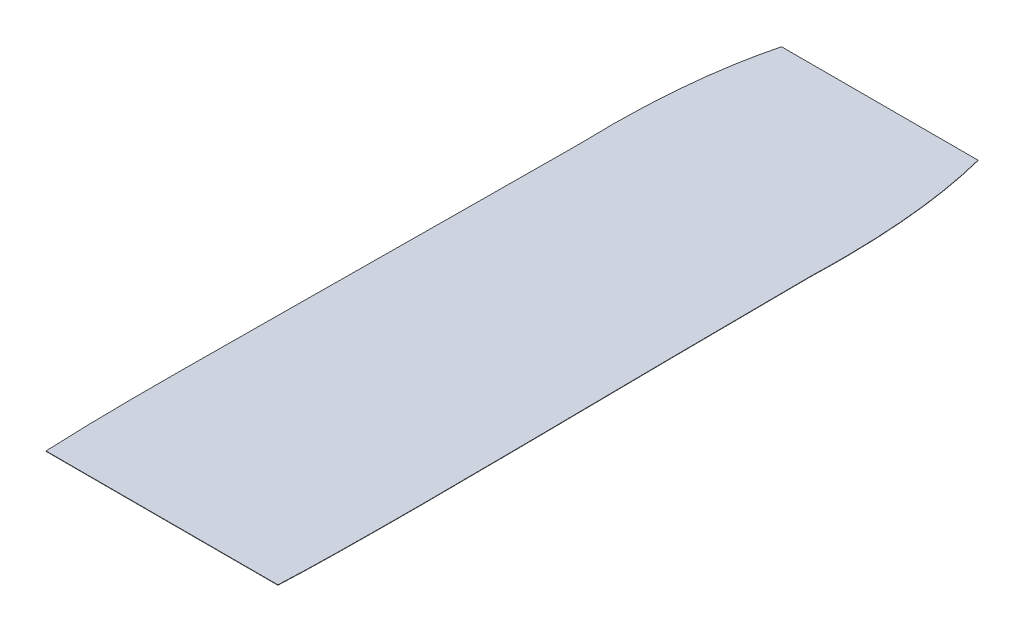
ISO-10303-21;
HEADER;
FILE_DESCRIPTION(('STEP AP214'),'2;1');
FILE_NAME('part.step','',(''),(''),'','','');
FILE_SCHEMA(('AUTOMOTIVE_DESIGN { 1 0 10303 214 1 1 1 1 }'));
ENDSEC;
DATA;
#1=APPLICATION_CONTEXT('core data for automotive mechanical design processes');
#2=APPLICATION_PROTOCOL_DEFINITION('international standard','automotive_design',2000,#1);
#3=PRODUCT_CONTEXT('',#1,'mechanical');
#4=PRODUCT('Part','Part','',(#3));
#5=PRODUCT_RELATED_PRODUCT_CATEGORY('part','',(#4));
#6=PRODUCT_DEFINITION_FORMATION('','',#4);
#7=PRODUCT_DEFINITION_CONTEXT('part definition',#1,'design');
#8=PRODUCT_DEFINITION('design','',#6,#7);
#9=PRODUCT_DEFINITION_SHAPE('','',#8);
#10=(LENGTH_UNIT() NAMED_UNIT(*) SI_UNIT(.MILLI.,.METRE.));
#11=(NAMED_UNIT(*) PLANE_ANGLE_UNIT() SI_UNIT($,.RADIAN.));
#12=(NAMED_UNIT(*) SI_UNIT($,.STERADIAN.) SOLID_ANGLE_UNIT());
#13=UNCERTAINTY_MEASURE_WITH_UNIT(LENGTH_MEASURE(1.E-05),#10,'distance_accuracy_value','');
#14=(GEOMETRIC_REPRESENTATION_CONTEXT(3) GLOBAL_UNCERTAINTY_ASSIGNED_CONTEXT((#13)) GLOBAL_UNIT_ASSIGNED_CONTEXT((#10,
#11,#12)) REPRESENTATION_CONTEXT('',''));
#15=CARTESIAN_POINT('',(0.,0.,0.));
#16=DIRECTION('',(0.,0.,1.));
#17=DIRECTION('',(1.,0.,0.));
#18=AXIS2_PLACEMENT_3D('',#15,#16,#17);
#19=CARTESIAN_POINT('',(-72.0046808004524,317.354714724633,-1400.77343560549));
#20=DIRECTION('',(0.,0.,1.));
#21=DIRECTION('',(1.,0.,0.));
#22=AXIS2_PLACEMENT_3D('',#19,#20,#21);
#23=PLANE('',#22);
#24=DIRECTION('',(-1.,0.,0.));
#25=VECTOR('',#24,1.);
#26=CARTESIAN_POINT('',(-72.0046808004524,130.274354409438,-1400.77343560549));
#27=LINE('',#26,#25);
#28=CARTESIAN_POINT('',(392.357809865248,130.274354409438,-1400.77343560549));
#29=VERTEX_POINT('',#28);
#30=CARTESIAN_POINT('',(-142.121848227152,130.274354409438,-1400.77343557769));
#31=VERTEX_POINT('',#30);
#32=EDGE_CURVE('E195',#29,#31,#27,.T.);
#33=ORIENTED_EDGE('',*,*,#32,.F.);
#34=DIRECTION('',(0.,1.,0.));
#35=VECTOR('',#34,1.);
#36=CARTESIAN_POINT('',(392.357809865248,128.784425539332,-1400.77343557769));
#37=LINE('',#36,#35);
#38=CARTESIAN_POINT('',(392.357809865248,129.274354409438,-1400.77343560549));
#39=VERTEX_POINT('',#38);
#40=EDGE_CURVE('E156',#39,#29,#37,.T.);
#41=ORIENTED_EDGE('',*,*,#40,.F.);
#42=DIRECTION('',(1.,0.,0.));
#43=VECTOR('',#42,1.);
#44=CARTESIAN_POINT('',(-72.0046808004524,129.274354409438,-1400.77343560549));
#45=LINE('',#44,#43);
#46=CARTESIAN_POINT('',(-142.121848227152,129.274354409438,-1400.77343557769));
#47=VERTEX_POINT('',#46);
#48=EDGE_CURVE('E355',#47,#39,#45,.T.);
#49=ORIENTED_EDGE('',*,*,#48,.F.);
#50=DIRECTION('',(0.,1.,0.));
#51=VECTOR('',#50,1.);
#52=CARTESIAN_POINT('',(-142.121848227152,128.784425539332,-1400.77343557769));
#53=LINE('',#52,#51);
#54=EDGE_CURVE('E36',#47,#31,#53,.T.);
#55=ORIENTED_EDGE('',*,*,#54,.T.);
#56=EDGE_LOOP('',(#33,#41,#49,#55));
#57=FACE_BOUND('',#56,.T.);
#58=ADVANCED_FACE('F33',(#57),#23,.F.);
#59=CARTESIAN_POINT('',(-190.555829317511,178.784425539332,-514.004715235418));
#60=DIRECTION('',(-0.999970152938198,0.,-0.0077261395766045));
#61=DIRECTION('',(-0.0077261395766045,0.,0.999970152938198));
#62=AXIS2_PLACEMENT_3D('',#59,#60,#61);
#63=PLANE('',#62);
#64=DIRECTION('',(0.,-1.,0.));
#65=VECTOR('',#64,1.);
#66=CARTESIAN_POINT('',(-190.571261738774,178.784425539332,-512.007345074322));
#67=LINE('',#66,#65);
#68=CARTESIAN_POINT('',(-190.571261738774,130.274354409438,-512.007345074322));
#69=VERTEX_POINT('',#68);
#70=CARTESIAN_POINT('',(-190.571261738774,129.274354409438,-512.007345074322));
#71=VERTEX_POINT('',#70);
#72=EDGE_CURVE('E215',#69,#71,#67,.T.);
#73=ORIENTED_EDGE('',*,*,#72,.F.);
#74=DIRECTION('',(0.0077261395766045,0.,-0.999970152938198));
#75=VECTOR('',#74,1.);
#76=CARTESIAN_POINT('',(-190.555829317511,130.274354409438,-514.004715235418));
#77=LINE('',#76,#75);
#78=CARTESIAN_POINT('',(-190.555829317511,130.274354409438,-514.004715235418));
#79=VERTEX_POINT('',#78);
#80=EDGE_CURVE('E56',#69,#79,#77,.T.);
#81=ORIENTED_EDGE('',*,*,#80,.T.);
#82=DIRECTION('',(0.,-1.,0.));
#83=VECTOR('',#82,1.);
#84=CARTESIAN_POINT('',(-190.555829317511,178.784425539332,-514.004715235418));
#85=LINE('',#84,#83);
#86=CARTESIAN_POINT('',(-190.555829317511,129.274354409438,-514.004715235418));
#87=VERTEX_POINT('',#86);
#88=EDGE_CURVE('E212',#79,#87,#85,.T.);
#89=ORIENTED_EDGE('',*,*,#88,.T.);
#90=DIRECTION('',(-0.0077261395766045,0.,0.999970152938198));
#91=VECTOR('',#90,1.);
#92=CARTESIAN_POINT('',(-190.555829317511,129.274354409438,-514.004715235418));
#93=LINE('',#92,#91);
#94=EDGE_CURVE('E129',#87,#71,#93,.T.);
#95=ORIENTED_EDGE('',*,*,#94,.T.);
#96=EDGE_LOOP('',(#73,#81,#89,#95));
#97=FACE_BOUND('',#96,.T.);
#98=ADVANCED_FACE('F177',(#97),#63,.T.);
#99=CARTESIAN_POINT('',(-155.592526066502,178.784425539332,552.03909036691));
#100=DIRECTION('',(0.,0.,1.));
#101=DIRECTION('',(1.,0.,0.));
#102=AXIS2_PLACEMENT_3D('',#99,#100,#101);
#103=PLANE('',#102);
#104=DIRECTION('',(0.,1.,0.));
#105=VECTOR('',#104,1.);
#106=CARTESIAN_POINT('',(440.559294575648,128.784425539332,552.039090366909));
#107=LINE('',#106,#105);
#108=CARTESIAN_POINT('',(440.559294575648,129.274354409438,552.03909036691));
#109=VERTEX_POINT('',#108);
#110=CARTESIAN_POINT('',(440.559294575648,130.274354409438,552.03909036691));
#111=VERTEX_POINT('',#110);
#112=EDGE_CURVE('E136',#109,#111,#107,.T.);
#113=ORIENTED_EDGE('',*,*,#112,.T.);
#114=DIRECTION('',(-1.,0.,0.));
#115=VECTOR('',#114,1.);
#116=CARTESIAN_POINT('',(-200.011016594819,130.274354409438,552.03909036691));
#117=LINE('',#116,#115);
#118=CARTESIAN_POINT('',(-190.323332937552,130.274354409438,552.03909036691));
#119=VERTEX_POINT('',#118);
#120=EDGE_CURVE('E120',#111,#119,#117,.T.);
#121=ORIENTED_EDGE('',*,*,#120,.T.);
#122=DIRECTION('',(0.,1.,0.));
#123=VECTOR('',#122,1.);
#124=CARTESIAN_POINT('',(-190.323332937552,128.784425539332,552.03909036691));
#125=LINE('',#124,#123);
#126=CARTESIAN_POINT('',(-190.323332937552,129.274354409438,552.03909036691));
#127=VERTEX_POINT('',#126);
#128=EDGE_CURVE('E139',#127,#119,#125,.T.);
#129=ORIENTED_EDGE('',*,*,#128,.F.);
#130=DIRECTION('',(1.,0.,0.));
#131=VECTOR('',#130,1.);
#132=CARTESIAN_POINT('',(-200.011016594819,129.274354409438,552.03909036691));
#133=LINE('',#132,#131);
#134=EDGE_CURVE('E49',#127,#109,#133,.T.);
#135=ORIENTED_EDGE('',*,*,#134,.T.);
#136=EDGE_LOOP('',(#113,#121,#129,#135));
#137=FACE_BOUND('',#136,.T.);
#138=ADVANCED_FACE('F142',(#137),#103,.T.);
#139=CARTESIAN_POINT('',(440.820829905303,178.784425539332,-510.258926198423));
#140=DIRECTION('',(0.999969906629394,0.,-0.00775795305478673));
#141=DIRECTION('',(-0.00775795305478673,0.,-0.999969906629394));
#142=AXIS2_PLACEMENT_3D('',#139,#140,#141);
#143=PLANE('',#142);
#144=DIRECTION('',(0.,-1.,0.));
#145=VECTOR('',#144,1.);
#146=CARTESIAN_POINT('',(440.796492080159,178.784425539332,-513.395976985423));
#147=LINE('',#146,#145);
#148=CARTESIAN_POINT('',(440.796492080159,130.274354409438,-513.395976985423));
#149=VERTEX_POINT('',#148);
#150=CARTESIAN_POINT('',(440.796492080159,129.274354409438,-513.395976985423));
#151=VERTEX_POINT('',#150);
#152=EDGE_CURVE('E209',#149,#151,#147,.T.);
#153=ORIENTED_EDGE('',*,*,#152,.F.);
#154=DIRECTION('',(0.00775795305478673,0.,0.999969906629394));
#155=VECTOR('',#154,1.);
#156=CARTESIAN_POINT('',(440.820829905303,130.274354409438,-510.258926198423));
#157=LINE('',#156,#155);
#158=CARTESIAN_POINT('',(440.820829905303,130.274354409438,-510.258926198423));
#159=VERTEX_POINT('',#158);
#160=EDGE_CURVE('E293',#149,#159,#157,.T.);
#161=ORIENTED_EDGE('',*,*,#160,.T.);
#162=DIRECTION('',(0.,-1.,0.));
#163=VECTOR('',#162,1.);
#164=CARTESIAN_POINT('',(440.820829905303,178.784425539332,-510.258926198423));
#165=LINE('',#164,#163);
#166=CARTESIAN_POINT('',(440.820829905303,129.274354409438,-510.258926198423));
#167=VERTEX_POINT('',#166);
#168=EDGE_CURVE('E218',#159,#167,#165,.T.);
#169=ORIENTED_EDGE('',*,*,#168,.T.);
#170=DIRECTION('',(-0.00775795305478673,0.,-0.999969906629394));
#171=VECTOR('',#170,1.);
#172=CARTESIAN_POINT('',(440.820829905303,129.274354409438,-510.258926198423));
#173=LINE('',#172,#171);
#174=EDGE_CURVE('E301',#167,#151,#173,.T.);
#175=ORIENTED_EDGE('',*,*,#174,.T.);
#176=EDGE_LOOP('',(#153,#161,#169,#175));
#177=FACE_BOUND('',#176,.T.);
#178=ADVANCED_FACE('F174',(#177),#143,.T.);
#179=CARTESIAN_POINT('',(392.357809865248,128.784425539332,-1400.77343557769));
#180=CARTESIAN_POINT('',(424.997052669176,128.784425539332,-1273.77599509534));
#181=CARTESIAN_POINT('',(444.759126928356,128.784425539332,-1111.03634228195));
#182=CARTESIAN_POINT('',(438.121071457448,128.784425539332,-898.390838476681));
#183=B_SPLINE_CURVE_WITH_KNOTS('',3,(#179,#180,#181,#182),.UNSPECIFIED.,.F.,.F.,(4,4),
(0.571508355999423,1.),.UNSPECIFIED.);
#184=DIRECTION('',(0.,1.,0.));
#185=VECTOR('',#184,1.);
#186=SURFACE_OF_LINEAR_EXTRUSION('',#183,#185);
#187=CARTESIAN_POINT('',(392.357809865248,130.274354409438,-1400.77343557769));
#188=CARTESIAN_POINT('',(424.997052669176,130.274354409438,-1273.77599509534));
#189=CARTESIAN_POINT('',(444.759126928356,130.274354409438,-1111.03634228195));
#190=CARTESIAN_POINT('',(438.121071457448,130.274354409438,-898.390838476681));
#191=B_SPLINE_CURVE_WITH_KNOTS('',3,(#187,#188,#189,#190),.UNSPECIFIED.,.F.,.F.,(4,4),
(0.571508355999423,1.),.UNSPECIFIED.);
#192=CARTESIAN_POINT('',(438.121071457448,130.274354409438,-898.390838476681));
#193=VERTEX_POINT('',#192);
#194=EDGE_CURVE('E200',#193,#29,#191,.F.);
#195=ORIENTED_EDGE('',*,*,#194,.F.);
#196=DIRECTION('',(0.,1.,0.));
#197=VECTOR('',#196,1.);
#198=CARTESIAN_POINT('',(438.121071457448,128.784425539332,-898.390838476681));
#199=LINE('',#198,#197);
#200=CARTESIAN_POINT('',(438.121071457448,129.274354409438,-898.390838476681));
#201=VERTEX_POINT('',#200);
#202=EDGE_CURVE('E208',#201,#193,#199,.T.);
#203=ORIENTED_EDGE('',*,*,#202,.F.);
#204=CARTESIAN_POINT('',(392.357809865248,129.274354409438,-1400.77343557769));
#205=CARTESIAN_POINT('',(424.997052669176,129.274354409438,-1273.77599509534));
#206=CARTESIAN_POINT('',(444.759126928356,129.274354409438,-1111.03634228195));
#207=CARTESIAN_POINT('',(438.121071457448,129.274354409438,-898.390838476681));
#208=B_SPLINE_CURVE_WITH_KNOTS('',3,(#204,#205,#206,#207),.UNSPECIFIED.,.F.,.F.,(4,4),
(0.571508355999423,1.),.UNSPECIFIED.);
#209=EDGE_CURVE('E207',#39,#201,#208,.T.);
#210=ORIENTED_EDGE('',*,*,#209,.F.);
#211=ORIENTED_EDGE('',*,*,#40,.T.);
#212=EDGE_LOOP('',(#195,#203,#210,#211));
#213=FACE_BOUND('',#212,.T.);
#214=ADVANCED_FACE('F169',(#213),#186,.F.);
#215=CARTESIAN_POINT('',(438.121071457448,128.784425539332,-898.390838476681));
#216=CARTESIAN_POINT('',(438.907855871214,128.784425539332,-769.879715580884));
#217=CARTESIAN_POINT('',(439.807782699388,128.784425539332,-641.369444082674));
#218=CARTESIAN_POINT('',(440.800633430048,128.784425539332,-512.85987183759));
#219=B_SPLINE_CURVE_WITH_KNOTS('',3,(#215,#216,#217,#218),.UNSPECIFIED.,.F.,.F.,(4,4),(0.,1.),.UNSPECIFIED.);
#220=DIRECTION('',(0.,1.,0.));
#221=VECTOR('',#220,1.);
#222=SURFACE_OF_LINEAR_EXTRUSION('',#219,#221);
#223=CARTESIAN_POINT('',(438.121071457448,130.274354409438,-898.390838476681));
#224=CARTESIAN_POINT('',(438.907855871214,130.274354409438,-769.879715580884));
#225=CARTESIAN_POINT('',(439.807782699388,130.274354409438,-641.369444082674));
#226=CARTESIAN_POINT('',(440.800633430048,130.274354409438,-512.85987183759));
#227=B_SPLINE_CURVE_WITH_KNOTS('',3,(#223,#224,#225,#226),.UNSPECIFIED.,.F.,.F.,(4,4),(0.,1.),.UNSPECIFIED.);
#228=EDGE_CURVE('E329',#149,#193,#227,.F.);
#229=ORIENTED_EDGE('',*,*,#228,.F.);
#230=ORIENTED_EDGE('',*,*,#152,.T.);
#231=CARTESIAN_POINT('',(438.121071457448,129.274354409438,-898.390838476681));
#232=CARTESIAN_POINT('',(438.907855871214,129.274354409438,-769.879715580884));
#233=CARTESIAN_POINT('',(439.807782699388,129.274354409438,-641.369444082674));
#234=CARTESIAN_POINT('',(440.800633430048,129.274354409438,-512.85987183759));
#235=B_SPLINE_CURVE_WITH_KNOTS('',3,(#231,#232,#233,#234),.UNSPECIFIED.,.F.,.F.,(4,4),(0.,1.),.UNSPECIFIED.);
#236=EDGE_CURVE('E353',#201,#151,#235,.T.);
#237=ORIENTED_EDGE('',*,*,#236,.F.);
#238=ORIENTED_EDGE('',*,*,#202,.T.);
#239=EDGE_LOOP('',(#229,#230,#237,#238));
#240=FACE_BOUND('',#239,.T.);
#241=ADVANCED_FACE('F173',(#240),#222,.F.);
#242=CARTESIAN_POINT('',(440.800633430048,128.784425539332,-512.859871837591));
#243=CARTESIAN_POINT('',(443.15122206887,128.784425539332,-208.667210221883));
#244=CARTESIAN_POINT('',(449.545543980227,128.784425539332,95.6004178072583));
#245=CARTESIAN_POINT('',(445.006281296166,128.784425539332,399.703094961221));
#246=B_SPLINE_CURVE_WITH_KNOTS('',3,(#242,#243,#244,#245),.UNSPECIFIED.,.F.,.F.,(4,4),(0.,1.),.UNSPECIFIED.);
#247=DIRECTION('',(0.,1.,0.));
#248=VECTOR('',#247,1.);
#249=SURFACE_OF_LINEAR_EXTRUSION('',#246,#248);
#250=CARTESIAN_POINT('',(440.800633430048,130.274354409438,-512.859871837591));
#251=CARTESIAN_POINT('',(443.15122206887,130.274354409438,-208.667210221883));
#252=CARTESIAN_POINT('',(449.545543980227,130.274354409438,95.6004178072583));
#253=CARTESIAN_POINT('',(445.006281296166,130.274354409438,399.703094961221));
#254=B_SPLINE_CURVE_WITH_KNOTS('',3,(#250,#251,#252,#253),.UNSPECIFIED.,.F.,.F.,(4,4),(0.,1.),.UNSPECIFIED.);
#255=CARTESIAN_POINT('',(445.006281296166,130.274354409438,399.703094961221));
#256=VERTEX_POINT('',#255);
#257=EDGE_CURVE('E290',#256,#159,#254,.F.);
#258=ORIENTED_EDGE('',*,*,#257,.F.);
#259=DIRECTION('',(0.,1.,0.));
#260=VECTOR('',#259,1.);
#261=CARTESIAN_POINT('',(445.006281296166,128.784425539332,399.703094961221));
#262=LINE('',#261,#260);
#263=CARTESIAN_POINT('',(445.006281296166,129.274354409438,399.703094961221));
#264=VERTEX_POINT('',#263);
#265=EDGE_CURVE('E144',#264,#256,#262,.T.);
#266=ORIENTED_EDGE('',*,*,#265,.F.);
#267=CARTESIAN_POINT('',(440.800633430048,129.274354409438,-512.859871837591));
#268=CARTESIAN_POINT('',(443.15122206887,129.274354409438,-208.667210221883));
#269=CARTESIAN_POINT('',(449.545543980227,129.274354409438,95.6004178072583));
#270=CARTESIAN_POINT('',(445.006281296166,129.274354409438,399.703094961221));
#271=B_SPLINE_CURVE_WITH_KNOTS('',3,(#267,#268,#269,#270),.UNSPECIFIED.,.F.,.F.,(4,4),(0.,1.),.UNSPECIFIED.);
#272=EDGE_CURVE('E298',#167,#264,#271,.T.);
#273=ORIENTED_EDGE('',*,*,#272,.F.);
#274=ORIENTED_EDGE('',*,*,#168,.F.);
#275=EDGE_LOOP('',(#258,#266,#273,#274));
#276=FACE_BOUND('',#275,.T.);
#277=ADVANCED_FACE('F273',(#276),#249,.F.);
#278=CARTESIAN_POINT('',(445.006281296166,128.784425539332,399.703094961221));
#279=DIRECTION('',(-0.999888607152886,0.,-0.0149255916419641));
#280=DIRECTION('',(0.0149255916419641,0.,-0.999888607152886));
#281=AXIS2_PLACEMENT_3D('',#278,#279,#280);
#282=PLANE('',#281);
#283=DIRECTION('',(0.0149255916419641,0.,-0.999888607152886));
#284=VECTOR('',#283,1.);
#285=CARTESIAN_POINT('',(445.006281296166,130.274354409438,399.703094961221));
#286=LINE('',#285,#284);
#287=CARTESIAN_POINT('',(445.006175558562,130.274354409438,399.710178487833));
#288=VERTEX_POINT('',#287);
#289=EDGE_CURVE('E140',#288,#256,#286,.T.);
#290=ORIENTED_EDGE('',*,*,#289,.F.);
#291=DIRECTION('',(0.,1.,0.));
#292=VECTOR('',#291,1.);
#293=CARTESIAN_POINT('',(445.006175558562,128.784425539332,399.710178487833));
#294=LINE('',#293,#292);
#295=CARTESIAN_POINT('',(445.006175558562,129.274354409438,399.710178487833));
#296=VERTEX_POINT('',#295);
#297=EDGE_CURVE('E138',#296,#288,#294,.T.);
#298=ORIENTED_EDGE('',*,*,#297,.F.);
#299=DIRECTION('',(-0.0149255916419641,0.,0.999888607152886));
#300=VECTOR('',#299,1.);
#301=CARTESIAN_POINT('',(445.006281296166,129.274354409438,399.703094961221));
#302=LINE('',#301,#300);
#303=EDGE_CURVE('E296',#264,#296,#302,.T.);
#304=ORIENTED_EDGE('',*,*,#303,.F.);
#305=ORIENTED_EDGE('',*,*,#265,.T.);
#306=EDGE_LOOP('',(#290,#298,#304,#305));
#307=FACE_BOUND('',#306,.T.);
#308=ADVANCED_FACE('F271',(#307),#282,.F.);
#309=CARTESIAN_POINT('',(445.006175558562,128.784425539332,399.710178487833));
#310=CARTESIAN_POINT('',(444.247971427042,128.784425539332,450.501714720233));
#311=CARTESIAN_POINT('',(442.930714642795,128.784425539332,501.281490469828));
#312=CARTESIAN_POINT('',(440.559294575648,128.784425539332,552.039090366909));
#313=B_SPLINE_CURVE_WITH_KNOTS('',3,(#309,#310,#311,#312),.UNSPECIFIED.,.F.,.F.,(4,4),(0.,1.),.UNSPECIFIED.);
#314=DIRECTION('',(0.,1.,0.));
#315=VECTOR('',#314,1.);
#316=SURFACE_OF_LINEAR_EXTRUSION('',#313,#315);
#317=CARTESIAN_POINT('',(445.006175558562,130.274354409438,399.710178487833));
#318=CARTESIAN_POINT('',(444.247971427042,130.274354409438,450.501714720233));
#319=CARTESIAN_POINT('',(442.930714642795,130.274354409438,501.281490469828));
#320=CARTESIAN_POINT('',(440.559294575648,130.274354409438,552.039090366909));
#321=B_SPLINE_CURVE_WITH_KNOTS('',3,(#317,#318,#319,#320),.UNSPECIFIED.,.F.,.F.,(4,4),(0.,1.),.UNSPECIFIED.);
#322=EDGE_CURVE('E123',#111,#288,#321,.F.);
#323=ORIENTED_EDGE('',*,*,#322,.F.);
#324=ORIENTED_EDGE('',*,*,#112,.F.);
#325=CARTESIAN_POINT('',(445.006175558562,129.274354409438,399.710178487833));
#326=CARTESIAN_POINT('',(444.247971427042,129.274354409438,450.501714720233));
#327=CARTESIAN_POINT('',(442.930714642795,129.274354409438,501.281490469828));
#328=CARTESIAN_POINT('',(440.559294575648,129.274354409438,552.039090366909));
#329=B_SPLINE_CURVE_WITH_KNOTS('',3,(#325,#326,#327,#328),.UNSPECIFIED.,.F.,.F.,(4,4),(0.,1.),.UNSPECIFIED.);
#330=EDGE_CURVE('E297',#296,#109,#329,.T.);
#331=ORIENTED_EDGE('',*,*,#330,.F.);
#332=ORIENTED_EDGE('',*,*,#297,.T.);
#333=EDGE_LOOP('',(#323,#324,#331,#332));
#334=FACE_BOUND('',#333,.T.);
#335=ADVANCED_FACE('F134',(#334),#316,.F.);
#336=CARTESIAN_POINT('',(-187.885109819352,128.784425539332,-898.390838476681));
#337=CARTESIAN_POINT('',(-194.52316529026,128.784425539332,-1111.03634228195));
#338=CARTESIAN_POINT('',(-174.76109103108,128.784425539332,-1273.77599509534));
#339=CARTESIAN_POINT('',(-142.121848227152,128.784425539332,-1400.77343557769));
#340=B_SPLINE_CURVE_WITH_KNOTS('',3,(#336,#337,#338,#339),.UNSPECIFIED.,.F.,.F.,(4,4),
(0.571508355999422,1.),.UNSPECIFIED.);
#341=DIRECTION('',(0.,1.,0.));
#342=VECTOR('',#341,1.);
#343=SURFACE_OF_LINEAR_EXTRUSION('',#340,#342);
#344=CARTESIAN_POINT('',(-187.885109819352,130.274354409438,-898.390838476681));
#345=CARTESIAN_POINT('',(-194.52316529026,130.274354409438,-1111.03634228195));
#346=CARTESIAN_POINT('',(-174.76109103108,130.274354409438,-1273.77599509534));
#347=CARTESIAN_POINT('',(-142.121848227152,130.274354409438,-1400.77343557769));
#348=B_SPLINE_CURVE_WITH_KNOTS('',3,(#344,#345,#346,#347),.UNSPECIFIED.,.F.,.F.,(4,4),
(0.571508355999422,1.),.UNSPECIFIED.);
#349=CARTESIAN_POINT('',(-187.885109819352,130.274354409438,-898.390838476681));
#350=VERTEX_POINT('',#349);
#351=EDGE_CURVE('E201',#31,#350,#348,.F.);
#352=ORIENTED_EDGE('',*,*,#351,.F.);
#353=ORIENTED_EDGE('',*,*,#54,.F.);
#354=CARTESIAN_POINT('',(-187.885109819352,129.274354409438,-898.390838476681));
#355=CARTESIAN_POINT('',(-194.52316529026,129.274354409438,-1111.03634228195));
#356=CARTESIAN_POINT('',(-174.76109103108,129.274354409438,-1273.77599509534));
#357=CARTESIAN_POINT('',(-142.121848227152,129.274354409438,-1400.77343557769));
#358=B_SPLINE_CURVE_WITH_KNOTS('',3,(#354,#355,#356,#357),.UNSPECIFIED.,.F.,.F.,(4,4),
(0.571508355999422,1.),.UNSPECIFIED.);
#359=CARTESIAN_POINT('',(-187.885109819352,129.274354409438,-898.390838476681));
#360=VERTEX_POINT('',#359);
#361=EDGE_CURVE('E369',#360,#47,#358,.T.);
#362=ORIENTED_EDGE('',*,*,#361,.F.);
#363=DIRECTION('',(0.,1.,0.));
#364=VECTOR('',#363,1.);
#365=CARTESIAN_POINT('',(-187.885109819352,128.784425539332,-898.390838476681));
#366=LINE('',#365,#364);
#367=EDGE_CURVE('E147',#360,#350,#366,.T.);
#368=ORIENTED_EDGE('',*,*,#367,.T.);
#369=EDGE_LOOP('',(#352,#353,#362,#368));
#370=FACE_BOUND('',#369,.T.);
#371=ADVANCED_FACE('F262',(#370),#343,.F.);
#372=CARTESIAN_POINT('',(-190.564671791952,128.784425539332,-512.85987183759));
#373=CARTESIAN_POINT('',(-189.57182106032,128.784425539332,-641.369444208598));
#374=CARTESIAN_POINT('',(-188.671894232296,128.784425539332,-769.879715715328));
#375=CARTESIAN_POINT('',(-187.885109819352,128.784425539332,-898.390838476681));
#376=B_SPLINE_CURVE_WITH_KNOTS('',3,(#372,#373,#374,#375),.UNSPECIFIED.,.F.,.F.,(4,4),(0.,1.),.UNSPECIFIED.);
#377=DIRECTION('',(0.,1.,0.));
#378=VECTOR('',#377,1.);
#379=SURFACE_OF_LINEAR_EXTRUSION('',#376,#378);
#380=CARTESIAN_POINT('',(-190.564671791952,130.274354409438,-512.85987183759));
#381=CARTESIAN_POINT('',(-189.57182106032,130.274354409438,-641.369444208598));
#382=CARTESIAN_POINT('',(-188.671894232296,130.274354409438,-769.879715715328));
#383=CARTESIAN_POINT('',(-187.885109819352,130.274354409438,-898.390838476681));
#384=B_SPLINE_CURVE_WITH_KNOTS('',3,(#380,#381,#382,#383),.UNSPECIFIED.,.F.,.F.,(4,4),(0.,1.),.UNSPECIFIED.);
#385=EDGE_CURVE('E313',#350,#79,#384,.F.);
#386=ORIENTED_EDGE('',*,*,#385,.F.);
#387=ORIENTED_EDGE('',*,*,#367,.F.);
#388=CARTESIAN_POINT('',(-190.564671791952,129.274354409438,-512.85987183759));
#389=CARTESIAN_POINT('',(-189.57182106032,129.274354409438,-641.369444208598));
#390=CARTESIAN_POINT('',(-188.671894232296,129.274354409438,-769.879715715328));
#391=CARTESIAN_POINT('',(-187.885109819352,129.274354409438,-898.390838476681));
#392=B_SPLINE_CURVE_WITH_KNOTS('',3,(#388,#389,#390,#391),.UNSPECIFIED.,.F.,.F.,(4,4),(0.,1.),.UNSPECIFIED.);
#393=EDGE_CURVE('E240',#87,#360,#392,.T.);
#394=ORIENTED_EDGE('',*,*,#393,.F.);
#395=ORIENTED_EDGE('',*,*,#88,.F.);
#396=EDGE_LOOP('',(#386,#387,#394,#395));
#397=FACE_BOUND('',#396,.T.);
#398=ADVANCED_FACE('F266',(#397),#379,.F.);
#399=CARTESIAN_POINT('',(-190.323332937552,128.784425539332,552.03909036691));
#400=CARTESIAN_POINT('',(-198.608397745605,128.784425539332,374.706524757046));
#401=CARTESIAN_POINT('',(-196.044795082047,128.784425539332,197.141831644182));
#402=CARTESIAN_POINT('',(-193.596280419779,128.784425539332,-157.860766082521));
#403=CARTESIAN_POINT('',(-191.936272040147,128.784425539332,-335.359341424359));
#404=CARTESIAN_POINT('',(-190.564671791952,128.784425539332,-512.85987183759));
#405=B_SPLINE_CURVE_WITH_KNOTS('',3,(#399,#400,#401,#402,#403,#404),.UNSPECIFIED.,.F.,.F.,(4,2,
4),(0.,0.5,1.),.UNSPECIFIED.);
#406=DIRECTION('',(0.,1.,0.));
#407=VECTOR('',#406,1.);
#408=SURFACE_OF_LINEAR_EXTRUSION('',#405,#407);
#409=CARTESIAN_POINT('',(-190.323332937552,130.274354409438,552.03909036691));
#410=CARTESIAN_POINT('',(-198.608397745605,130.274354409438,374.706524757046));
#411=CARTESIAN_POINT('',(-196.044795082047,130.274354409438,197.141831644182));
#412=CARTESIAN_POINT('',(-193.596280419779,130.274354409438,-157.860766082521));
#413=CARTESIAN_POINT('',(-191.936272040147,130.274354409438,-335.359341424359));
#414=CARTESIAN_POINT('',(-190.564671791952,130.274354409438,-512.85987183759));
#415=B_SPLINE_CURVE_WITH_KNOTS('',3,(#409,#410,#411,#412,#413,#414),.UNSPECIFIED.,.F.,.F.,(4,2,
4),(0.,0.5,1.),.UNSPECIFIED.);
#416=EDGE_CURVE('E11',#69,#119,#415,.F.);
#417=ORIENTED_EDGE('',*,*,#416,.F.);
#418=ORIENTED_EDGE('',*,*,#72,.T.);
#419=CARTESIAN_POINT('',(-190.323332937552,129.274354409438,552.03909036691));
#420=CARTESIAN_POINT('',(-198.608397745605,129.274354409438,374.706524757046));
#421=CARTESIAN_POINT('',(-196.044795082047,129.274354409438,197.141831644182));
#422=CARTESIAN_POINT('',(-193.596280419779,129.274354409438,-157.860766082521));
#423=CARTESIAN_POINT('',(-191.936272040147,129.274354409438,-335.359341424359));
#424=CARTESIAN_POINT('',(-190.564671791952,129.274354409438,-512.85987183759));
#425=B_SPLINE_CURVE_WITH_KNOTS('',3,(#419,#420,#421,#422,#423,#424),.UNSPECIFIED.,.F.,.F.,(4,2,
4),(0.,0.5,1.),.UNSPECIFIED.);
#426=EDGE_CURVE('E42',#127,#71,#425,.T.);
#427=ORIENTED_EDGE('',*,*,#426,.F.);
#428=ORIENTED_EDGE('',*,*,#128,.T.);
#429=EDGE_LOOP('',(#417,#418,#427,#428));
#430=FACE_BOUND('',#429,.T.);
#431=ADVANCED_FACE('F242',(#430),#408,.F.);
#432=CARTESIAN_POINT('',(-200.011016594819,129.274354409438,-1400.77393557769));
#433=DIRECTION('',(0.,-1.,0.));
#434=DIRECTION('',(0.,0.,-1.));
#435=AXIS2_PLACEMENT_3D('',#432,#433,#434);
#436=PLANE('',#435);
#437=ORIENTED_EDGE('',*,*,#330,.T.);
#438=ORIENTED_EDGE('',*,*,#134,.F.);
#439=ORIENTED_EDGE('',*,*,#426,.T.);
#440=ORIENTED_EDGE('',*,*,#94,.F.);
#441=ORIENTED_EDGE('',*,*,#393,.T.);
#442=ORIENTED_EDGE('',*,*,#361,.T.);
#443=ORIENTED_EDGE('',*,*,#48,.T.);
#444=ORIENTED_EDGE('',*,*,#209,.T.);
#445=ORIENTED_EDGE('',*,*,#236,.T.);
#446=ORIENTED_EDGE('',*,*,#174,.F.);
#447=ORIENTED_EDGE('',*,*,#272,.T.);
#448=ORIENTED_EDGE('',*,*,#303,.T.);
#449=EDGE_LOOP('',(#437,#438,#439,#440,#441,#442,#443,#444,#445,#446,#447,#448));
#450=FACE_BOUND('',#449,.T.);
#451=ADVANCED_FACE('F235',(#450),#436,.T.);
#452=CARTESIAN_POINT('',(-200.011016594819,130.274354409438,-1400.77393557769));
#453=DIRECTION('',(0.,1.,0.));
#454=DIRECTION('',(0.,0.,1.));
#455=AXIS2_PLACEMENT_3D('',#452,#453,#454);
#456=PLANE('',#455);
#457=ORIENTED_EDGE('',*,*,#322,.T.);
#458=ORIENTED_EDGE('',*,*,#289,.T.);
#459=ORIENTED_EDGE('',*,*,#257,.T.);
#460=ORIENTED_EDGE('',*,*,#160,.F.);
#461=ORIENTED_EDGE('',*,*,#228,.T.);
#462=ORIENTED_EDGE('',*,*,#194,.T.);
#463=ORIENTED_EDGE('',*,*,#32,.T.);
#464=ORIENTED_EDGE('',*,*,#351,.T.);
#465=ORIENTED_EDGE('',*,*,#385,.T.);
#466=ORIENTED_EDGE('',*,*,#80,.F.);
#467=ORIENTED_EDGE('',*,*,#416,.T.);
#468=ORIENTED_EDGE('',*,*,#120,.F.);
#469=EDGE_LOOP('',(#457,#458,#459,#460,#461,#462,#463,#464,#465,#466,#467,#468));
#470=FACE_BOUND('',#469,.T.);
#471=ADVANCED_FACE('F122',(#470),#456,.T.);
#472=CLOSED_SHELL('',(#58,#98,#138,#178,#214,#241,#277,#308,#335,#371,#398,#431,#451,#471));
#473=MANIFOLD_SOLID_BREP('B2',#472);
#474=ADVANCED_BREP_SHAPE_REPRESENTATION('',(#18,#473),#14);
#475=SHAPE_DEFINITION_REPRESENTATION(#9,#474);
ENDSEC;
END-ISO-10303-21;
